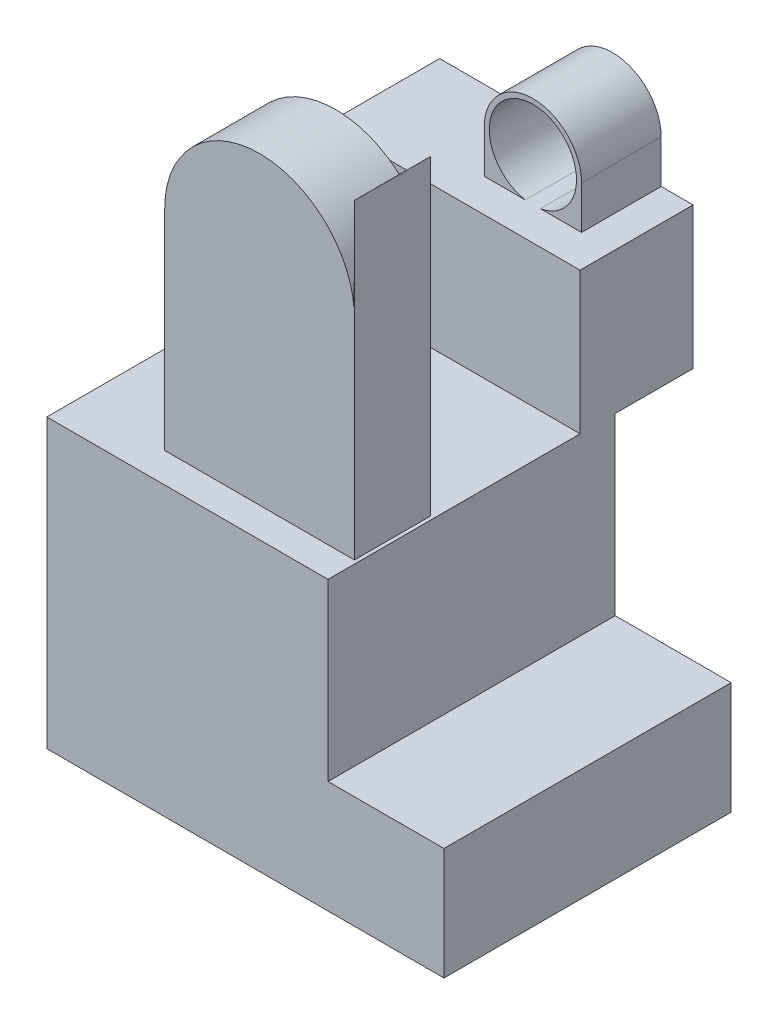
ISO-10303-21;
HEADER;
FILE_DESCRIPTION(('STEP AP214'),'2;1');
FILE_NAME('part.step','',(''),(''),'','','');
FILE_SCHEMA(('AUTOMOTIVE_DESIGN { 1 0 10303 214 1 1 1 1 }'));
ENDSEC;
DATA;
#1=APPLICATION_CONTEXT('core data for automotive mechanical design processes');
#2=APPLICATION_PROTOCOL_DEFINITION('international standard','automotive_design',2000,#1);
#3=PRODUCT_CONTEXT('',#1,'mechanical');
#4=PRODUCT('Part','Part','',(#3));
#5=PRODUCT_RELATED_PRODUCT_CATEGORY('part','',(#4));
#6=PRODUCT_DEFINITION_FORMATION('','',#4);
#7=PRODUCT_DEFINITION_CONTEXT('part definition',#1,'design');
#8=PRODUCT_DEFINITION('design','',#6,#7);
#9=PRODUCT_DEFINITION_SHAPE('','',#8);
#10=(LENGTH_UNIT() NAMED_UNIT(*) SI_UNIT(.MILLI.,.METRE.));
#11=(NAMED_UNIT(*) PLANE_ANGLE_UNIT() SI_UNIT($,.RADIAN.));
#12=(NAMED_UNIT(*) SI_UNIT($,.STERADIAN.) SOLID_ANGLE_UNIT());
#13=UNCERTAINTY_MEASURE_WITH_UNIT(LENGTH_MEASURE(1.E-05),#10,'distance_accuracy_value','');
#14=(GEOMETRIC_REPRESENTATION_CONTEXT(3) GLOBAL_UNCERTAINTY_ASSIGNED_CONTEXT((#13)) GLOBAL_UNIT_ASSIGNED_CONTEXT((#10,
#11,#12)) REPRESENTATION_CONTEXT('',''));
#15=CARTESIAN_POINT('',(0.,0.,0.));
#16=DIRECTION('',(0.,0.,1.));
#17=DIRECTION('',(1.,0.,0.));
#18=AXIS2_PLACEMENT_3D('',#15,#16,#17);
#19=CARTESIAN_POINT('',(-18.0355036301896,121.857061946903,45.63691496334));
#20=DIRECTION('',(1.,0.,0.));
#21=DIRECTION('',(0.,0.,-1.));
#22=AXIS2_PLACEMENT_3D('',#19,#20,#21);
#23=PLANE('',#22);
#24=DIRECTION('',(0.,0.,1.));
#25=VECTOR('',#24,1.);
#26=CARTESIAN_POINT('',(-18.0355036301896,96.2330757233509,42.7381903510704));
#27=LINE('',#26,#25);
#28=CARTESIAN_POINT('',(-18.0355036301896,96.2330757233509,45.63691496334));
#29=VERTEX_POINT('',#28);
#30=CARTESIAN_POINT('',(-18.0355036301896,96.2330757233509,64.8361903510704));
#31=VERTEX_POINT('',#30);
#32=EDGE_CURVE('E247',#29,#31,#27,.T.);
#33=ORIENTED_EDGE('',*,*,#32,.F.);
#34=DIRECTION('',(0.,-1.,0.));
#35=VECTOR('',#34,1.);
#36=CARTESIAN_POINT('',(-18.0355036301896,121.857061946903,45.63691496334));
#37=LINE('',#36,#35);
#38=CARTESIAN_POINT('',(-18.0355036301896,43.3710619469027,45.63691496334));
#39=VERTEX_POINT('',#38);
#40=EDGE_CURVE('E261',#29,#39,#37,.T.);
#41=ORIENTED_EDGE('',*,*,#40,.T.);
#42=DIRECTION('',(0.,0.,1.));
#43=VECTOR('',#42,1.);
#44=CARTESIAN_POINT('',(-18.0355036301896,43.3710619469027,45.63691496334));
#45=LINE('',#44,#43);
#46=CARTESIAN_POINT('',(-18.0355036301896,43.3710619469027,64.8361903510704));
#47=VERTEX_POINT('',#46);
#48=EDGE_CURVE('E252',#39,#47,#45,.T.);
#49=ORIENTED_EDGE('',*,*,#48,.T.);
#50=DIRECTION('',(0.,-1.,0.));
#51=VECTOR('',#50,1.);
#52=CARTESIAN_POINT('',(-18.0355036301896,121.857061946903,64.8361903510704));
#53=LINE('',#52,#51);
#54=EDGE_CURVE('E279',#31,#47,#53,.T.);
#55=ORIENTED_EDGE('',*,*,#54,.F.);
#56=EDGE_LOOP('',(#33,#41,#49,#55));
#57=FACE_BOUND('',#56,.T.);
#58=ADVANCED_FACE('F35',(#57),#23,.F.);
#59=CARTESIAN_POINT('',(-18.0355036301896,121.857061946903,64.8361903510704));
#60=DIRECTION('',(0.,0.,-1.));
#61=DIRECTION('',(-1.,0.,0.));
#62=AXIS2_PLACEMENT_3D('',#59,#60,#61);
#63=PLANE('',#62);
#64=CARTESIAN_POINT('',(5.87302798471995,96.2330757233509,64.8361903510704));
#65=DIRECTION('',(0.,0.,1.));
#66=DIRECTION('',(1.,0.,0.));
#67=AXIS2_PLACEMENT_3D('',#64,#65,#66);
#68=CIRCLE('',#67,23.9085316149096);
#69=CARTESIAN_POINT('',(29.7244375970077,97.8847849859018,64.8361903510704));
#70=VERTEX_POINT('',#69);
#71=EDGE_CURVE('E240',#70,#31,#68,.T.);
#72=ORIENTED_EDGE('',*,*,#71,.T.);
#73=ORIENTED_EDGE('',*,*,#54,.T.);
#74=DIRECTION('',(1.,0.,0.));
#75=VECTOR('',#74,1.);
#76=CARTESIAN_POINT('',(-18.0355036301896,43.3710619469027,64.8361903510704));
#77=LINE('',#76,#75);
#78=CARTESIAN_POINT('',(29.7815595996295,43.3710619469027,64.8361903510704));
#79=VERTEX_POINT('',#78);
#80=EDGE_CURVE('E264',#47,#79,#77,.T.);
#81=ORIENTED_EDGE('',*,*,#80,.T.);
#82=DIRECTION('',(0.,-1.,0.));
#83=VECTOR('',#82,1.);
#84=CARTESIAN_POINT('',(29.7815595996295,121.857061946903,64.8361903510704));
#85=LINE('',#84,#83);
#86=CARTESIAN_POINT('',(29.7815595996295,121.857061946903,64.8361903510704));
#87=VERTEX_POINT('',#86);
#88=EDGE_CURVE('E276',#87,#79,#85,.T.);
#89=ORIENTED_EDGE('',*,*,#88,.F.);
#90=DIRECTION('',(1.,0.,0.));
#91=VECTOR('',#90,1.);
#92=CARTESIAN_POINT('',(-18.0355036301896,121.857061946903,64.8361903510704));
#93=LINE('',#92,#91);
#94=CARTESIAN_POINT('',(29.7749437255236,121.857061946903,64.8361903510704));
#95=VERTEX_POINT('',#94);
#96=EDGE_CURVE('E253',#95,#87,#93,.T.);
#97=ORIENTED_EDGE('',*,*,#96,.F.);
#98=DIRECTION('',(-0.00210685103063139,-0.999997780586905,0.));
#99=VECTOR('',#98,1.);
#100=CARTESIAN_POINT('',(29.5180774531179,-0.0621903299303783,64.8361903510704));
#101=LINE('',#100,#99);
#102=EDGE_CURVE('E243',#95,#70,#101,.T.);
#103=ORIENTED_EDGE('',*,*,#102,.T.);
#104=EDGE_LOOP('',(#72,#73,#81,#89,#97,#103));
#105=FACE_BOUND('',#104,.T.);
#106=ADVANCED_FACE('F418',(#105),#63,.F.);
#107=CARTESIAN_POINT('',(-18.0355036301896,121.857061946903,45.63691496334));
#108=DIRECTION('',(0.,0.,1.));
#109=DIRECTION('',(1.,0.,0.));
#110=AXIS2_PLACEMENT_3D('',#107,#108,#109);
#111=PLANE('',#110);
#112=CARTESIAN_POINT('',(5.87302798471995,96.2330757233509,45.63691496334));
#113=DIRECTION('',(0.,0.,1.));
#114=DIRECTION('',(1.,0.,0.));
#115=AXIS2_PLACEMENT_3D('',#112,#113,#114);
#116=CIRCLE('',#115,23.9085316149096);
#117=CARTESIAN_POINT('',(29.7244375970077,97.8847849859018,45.63691496334));
#118=VERTEX_POINT('',#117);
#119=EDGE_CURVE('E350',#118,#29,#116,.T.);
#120=ORIENTED_EDGE('',*,*,#119,.F.);
#121=DIRECTION('',(-0.00210685103063139,-0.999997780586905,0.));
#122=VECTOR('',#121,1.);
#123=CARTESIAN_POINT('',(29.7747315034931,121.756332680177,45.63691496334));
#124=LINE('',#123,#122);
#125=CARTESIAN_POINT('',(29.7749437255236,121.857061946903,45.63691496334));
#126=VERTEX_POINT('',#125);
#127=EDGE_CURVE('E249',#126,#118,#124,.T.);
#128=ORIENTED_EDGE('',*,*,#127,.F.);
#129=DIRECTION('',(-1.,0.,0.));
#130=VECTOR('',#129,1.);
#131=CARTESIAN_POINT('',(-18.0355036301896,121.857061946903,45.63691496334));
#132=LINE('',#131,#130);
#133=CARTESIAN_POINT('',(29.7815595996295,121.857061946903,45.63691496334));
#134=VERTEX_POINT('',#133);
#135=EDGE_CURVE('E258',#134,#126,#132,.T.);
#136=ORIENTED_EDGE('',*,*,#135,.F.);
#137=DIRECTION('',(0.,-1.,0.));
#138=VECTOR('',#137,1.);
#139=CARTESIAN_POINT('',(29.7815595996295,121.857061946903,45.63691496334));
#140=LINE('',#139,#138);
#141=CARTESIAN_POINT('',(29.7815595996295,43.3710619469027,45.63691496334));
#142=VERTEX_POINT('',#141);
#143=EDGE_CURVE('E273',#134,#142,#140,.T.);
#144=ORIENTED_EDGE('',*,*,#143,.T.);
#145=DIRECTION('',(-1.,0.,0.));
#146=VECTOR('',#145,1.);
#147=CARTESIAN_POINT('',(-18.0355036301896,43.3710619469027,45.63691496334));
#148=LINE('',#147,#146);
#149=EDGE_CURVE('E256',#142,#39,#148,.T.);
#150=ORIENTED_EDGE('',*,*,#149,.T.);
#151=ORIENTED_EDGE('',*,*,#40,.F.);
#152=EDGE_LOOP('',(#120,#128,#136,#144,#150,#151));
#153=FACE_BOUND('',#152,.T.);
#154=ADVANCED_FACE('F425',(#153),#111,.F.);
#155=CARTESIAN_POINT('',(0.,121.857061946903,0.));
#156=DIRECTION('',(0.,1.,0.));
#157=DIRECTION('',(0.,0.,1.));
#158=AXIS2_PLACEMENT_3D('',#155,#156,#157);
#159=PLANE('',#158);
#160=ORIENTED_EDGE('',*,*,#135,.T.);
#161=DIRECTION('',(0.,0.,1.));
#162=VECTOR('',#161,1.);
#163=CARTESIAN_POINT('',(29.7749437255235,121.857061946903,0.));
#164=LINE('',#163,#162);
#165=EDGE_CURVE('E347',#126,#95,#164,.T.);
#166=ORIENTED_EDGE('',*,*,#165,.T.);
#167=ORIENTED_EDGE('',*,*,#96,.T.);
#168=DIRECTION('',(0.,0.,-1.));
#169=VECTOR('',#168,1.);
#170=CARTESIAN_POINT('',(29.7815595996295,121.857061946903,45.63691496334));
#171=LINE('',#170,#169);
#172=EDGE_CURVE('E255',#87,#134,#171,.T.);
#173=ORIENTED_EDGE('',*,*,#172,.T.);
#174=EDGE_LOOP('',(#160,#166,#167,#173));
#175=FACE_BOUND('',#174,.T.);
#176=ADVANCED_FACE('F446',(#175),#159,.T.);
#177=CARTESIAN_POINT('',(30.6814412238325,43.3710619469027,72.39));
#178=DIRECTION('',(0.,-1.,0.));
#179=DIRECTION('',(0.,0.,-1.));
#180=AXIS2_PLACEMENT_3D('',#177,#178,#179);
#181=PLANE('',#180);
#182=DIRECTION('',(1.,0.,0.));
#183=VECTOR('',#182,1.);
#184=CARTESIAN_POINT('',(30.6814412238325,43.3710619469027,8.85044599904986));
#185=LINE('',#184,#183);
#186=CARTESIAN_POINT('',(-33.2131284429536,43.3710619469027,8.85044599904985));
#187=VERTEX_POINT('',#186);
#188=CARTESIAN_POINT('',(30.6814412238325,43.3710619469027,8.85044599904985));
#189=VERTEX_POINT('',#188);
#190=EDGE_CURVE('E282',#187,#189,#185,.T.);
#191=ORIENTED_EDGE('',*,*,#190,.F.);
#192=DIRECTION('',(0.,0.,1.));
#193=VECTOR('',#192,1.);
#194=CARTESIAN_POINT('',(-33.2131284429536,43.3710619469027,8.85044599904985));
#195=LINE('',#194,#193);
#196=CARTESIAN_POINT('',(-33.2131284429536,43.3710619469027,0.));
#197=VERTEX_POINT('',#196);
#198=EDGE_CURVE('E290',#197,#187,#195,.T.);
#199=ORIENTED_EDGE('',*,*,#198,.F.);
#200=DIRECTION('',(-1.,0.,0.));
#201=VECTOR('',#200,1.);
#202=CARTESIAN_POINT('',(30.6814412238325,43.3710619469027,0.));
#203=LINE('',#202,#201);
#204=CARTESIAN_POINT('',(-40.2025410770525,43.3710619469027,0.));
#205=VERTEX_POINT('',#204);
#206=EDGE_CURVE('E328',#197,#205,#203,.T.);
#207=ORIENTED_EDGE('',*,*,#206,.T.);
#208=DIRECTION('',(0.,0.,-1.));
#209=VECTOR('',#208,1.);
#210=CARTESIAN_POINT('',(-40.2025410770525,43.3710619469027,72.39));
#211=LINE('',#210,#209);
#212=CARTESIAN_POINT('',(-40.2025410770525,43.3710619469027,72.39));
#213=VERTEX_POINT('',#212);
#214=EDGE_CURVE('E318',#213,#205,#211,.T.);
#215=ORIENTED_EDGE('',*,*,#214,.F.);
#216=DIRECTION('',(-1.,0.,0.));
#217=VECTOR('',#216,1.);
#218=CARTESIAN_POINT('',(30.6814412238325,43.3710619469027,72.39));
#219=LINE('',#218,#217);
#220=CARTESIAN_POINT('',(30.6814412238325,43.3710619469027,72.39));
#221=VERTEX_POINT('',#220);
#222=EDGE_CURVE('E316',#221,#213,#219,.T.);
#223=ORIENTED_EDGE('',*,*,#222,.F.);
#224=DIRECTION('',(0.,0.,-1.));
#225=VECTOR('',#224,1.);
#226=CARTESIAN_POINT('',(30.6814412238325,43.3710619469027,72.39));
#227=LINE('',#226,#225);
#228=EDGE_CURVE('E333',#221,#189,#227,.T.);
#229=ORIENTED_EDGE('',*,*,#228,.T.);
#230=EDGE_LOOP('',(#191,#199,#207,#215,#223,#229));
#231=FACE_BOUND('',#230,.T.);
#232=ORIENTED_EDGE('',*,*,#48,.F.);
#233=ORIENTED_EDGE('',*,*,#149,.F.);
#234=DIRECTION('',(0.,0.,-1.));
#235=VECTOR('',#234,1.);
#236=CARTESIAN_POINT('',(29.7815595996295,43.3710619469027,45.63691496334));
#237=LINE('',#236,#235);
#238=EDGE_CURVE('E267',#79,#142,#237,.T.);
#239=ORIENTED_EDGE('',*,*,#238,.F.);
#240=ORIENTED_EDGE('',*,*,#80,.F.);
#241=EDGE_LOOP('',(#232,#233,#239,#240));
#242=FACE_BOUND('',#241,.T.);
#243=ADVANCED_FACE('F375',(#231,#242),#181,.F.);
#244=CARTESIAN_POINT('',(-40.2025410770525,-0.764247787610634,72.39));
#245=DIRECTION('',(1.,0.,0.));
#246=DIRECTION('',(0.,0.,-1.));
#247=AXIS2_PLACEMENT_3D('',#244,#245,#246);
#248=PLANE('',#247);
#249=DIRECTION('',(0.,-1.,0.));
#250=VECTOR('',#249,1.);
#251=CARTESIAN_POINT('',(-40.2025410770525,-0.764247787610634,0.));
#252=LINE('',#251,#250);
#253=CARTESIAN_POINT('',(-40.2025410770525,-29.0414159292035,0.));
#254=VERTEX_POINT('',#253);
#255=EDGE_CURVE('E295',#205,#254,#252,.T.);
#256=ORIENTED_EDGE('',*,*,#255,.T.);
#257=DIRECTION('',(0.,0.,-1.));
#258=VECTOR('',#257,1.);
#259=CARTESIAN_POINT('',(-40.2025410770525,-29.0414159292035,72.39));
#260=LINE('',#259,#258);
#261=CARTESIAN_POINT('',(-40.2025410770525,-29.0414159292035,72.39));
#262=VERTEX_POINT('',#261);
#263=EDGE_CURVE('E344',#262,#254,#260,.T.);
#264=ORIENTED_EDGE('',*,*,#263,.F.);
#265=DIRECTION('',(0.,-1.,0.));
#266=VECTOR('',#265,1.);
#267=CARTESIAN_POINT('',(-40.2025410770525,-0.764247787610634,72.39));
#268=LINE('',#267,#266);
#269=EDGE_CURVE('E305',#213,#262,#268,.T.);
#270=ORIENTED_EDGE('',*,*,#269,.F.);
#271=ORIENTED_EDGE('',*,*,#214,.T.);
#272=EDGE_LOOP('',(#256,#264,#270,#271));
#273=FACE_BOUND('',#272,.T.);
#274=ADVANCED_FACE('F37',(#273),#248,.F.);
#275=CARTESIAN_POINT('',(-40.2025410770525,-29.0414159292035,72.39));
#276=DIRECTION('',(0.,1.,0.));
#277=DIRECTION('',(0.,0.,1.));
#278=AXIS2_PLACEMENT_3D('',#275,#276,#277);
#279=PLANE('',#278);
#280=DIRECTION('',(1.,0.,0.));
#281=VECTOR('',#280,1.);
#282=CARTESIAN_POINT('',(-40.2025410770525,-29.0414159292035,0.));
#283=LINE('',#282,#281);
#284=CARTESIAN_POINT('',(59.9139190999387,-29.0414159292035,0.));
#285=VERTEX_POINT('',#284);
#286=EDGE_CURVE('E320',#254,#285,#283,.T.);
#287=ORIENTED_EDGE('',*,*,#286,.T.);
#288=DIRECTION('',(0.,0.,-1.));
#289=VECTOR('',#288,1.);
#290=CARTESIAN_POINT('',(59.9139190999387,-29.0414159292035,72.39));
#291=LINE('',#290,#289);
#292=CARTESIAN_POINT('',(59.9139190999387,-29.0414159292035,72.39));
#293=VERTEX_POINT('',#292);
#294=EDGE_CURVE('E341',#293,#285,#291,.T.);
#295=ORIENTED_EDGE('',*,*,#294,.F.);
#296=DIRECTION('',(1.,0.,0.));
#297=VECTOR('',#296,1.);
#298=CARTESIAN_POINT('',(-40.2025410770525,-29.0414159292035,72.39));
#299=LINE('',#298,#297);
#300=EDGE_CURVE('E307',#262,#293,#299,.T.);
#301=ORIENTED_EDGE('',*,*,#300,.F.);
#302=ORIENTED_EDGE('',*,*,#263,.T.);
#303=EDGE_LOOP('',(#287,#295,#301,#302));
#304=FACE_BOUND('',#303,.T.);
#305=ADVANCED_FACE('F407',(#304),#279,.F.);
#306=CARTESIAN_POINT('',(59.9139190999387,-0.764247787610634,72.39));
#307=DIRECTION('',(-1.,0.,0.));
#308=DIRECTION('',(0.,0.,1.));
#309=AXIS2_PLACEMENT_3D('',#306,#307,#308);
#310=PLANE('',#309);
#311=DIRECTION('',(0.,1.,0.));
#312=VECTOR('',#311,1.);
#313=CARTESIAN_POINT('',(59.9139190999387,-0.764247787610634,0.));
#314=LINE('',#313,#312);
#315=CARTESIAN_POINT('',(59.9139190999387,-0.764247787610634,0.));
#316=VERTEX_POINT('',#315);
#317=EDGE_CURVE('E322',#285,#316,#314,.T.);
#318=ORIENTED_EDGE('',*,*,#317,.T.);
#319=DIRECTION('',(0.,0.,-1.));
#320=VECTOR('',#319,1.);
#321=CARTESIAN_POINT('',(59.9139190999387,-0.764247787610634,72.39));
#322=LINE('',#321,#320);
#323=CARTESIAN_POINT('',(59.9139190999387,-0.764247787610634,72.39));
#324=VERTEX_POINT('',#323);
#325=EDGE_CURVE('E338',#324,#316,#322,.T.);
#326=ORIENTED_EDGE('',*,*,#325,.F.);
#327=DIRECTION('',(0.,1.,0.));
#328=VECTOR('',#327,1.);
#329=CARTESIAN_POINT('',(59.9139190999387,-0.764247787610634,72.39));
#330=LINE('',#329,#328);
#331=EDGE_CURVE('E310',#293,#324,#330,.T.);
#332=ORIENTED_EDGE('',*,*,#331,.F.);
#333=ORIENTED_EDGE('',*,*,#294,.T.);
#334=EDGE_LOOP('',(#318,#326,#332,#333));
#335=FACE_BOUND('',#334,.T.);
#336=ADVANCED_FACE('F409',(#335),#310,.F.);
#337=CARTESIAN_POINT('',(30.6814412238325,-0.764247787610625,72.39));
#338=DIRECTION('',(0.,-1.,0.));
#339=DIRECTION('',(1.,0.,0.));
#340=AXIS2_PLACEMENT_3D('',#337,#338,#339);
#341=PLANE('',#340);
#342=DIRECTION('',(-1.,0.,0.));
#343=VECTOR('',#342,1.);
#344=CARTESIAN_POINT('',(30.6814412238325,-0.764247787610625,0.));
#345=LINE('',#344,#343);
#346=CARTESIAN_POINT('',(30.6814412238325,-0.764247787610625,0.));
#347=VERTEX_POINT('',#346);
#348=EDGE_CURVE('E324',#316,#347,#345,.T.);
#349=ORIENTED_EDGE('',*,*,#348,.T.);
#350=DIRECTION('',(0.,0.,-1.));
#351=VECTOR('',#350,1.);
#352=CARTESIAN_POINT('',(30.6814412238325,-0.764247787610625,72.39));
#353=LINE('',#352,#351);
#354=CARTESIAN_POINT('',(30.6814412238325,-0.764247787610625,72.39));
#355=VERTEX_POINT('',#354);
#356=EDGE_CURVE('E335',#355,#347,#353,.T.);
#357=ORIENTED_EDGE('',*,*,#356,.F.);
#358=DIRECTION('',(-1.,0.,0.));
#359=VECTOR('',#358,1.);
#360=CARTESIAN_POINT('',(30.6814412238325,-0.764247787610625,72.39));
#361=LINE('',#360,#359);
#362=EDGE_CURVE('E312',#324,#355,#361,.T.);
#363=ORIENTED_EDGE('',*,*,#362,.F.);
#364=ORIENTED_EDGE('',*,*,#325,.T.);
#365=EDGE_LOOP('',(#349,#357,#363,#364));
#366=FACE_BOUND('',#365,.T.);
#367=ADVANCED_FACE('F386',(#366),#341,.F.);
#368=CARTESIAN_POINT('',(30.6814412238325,-0.764247787610625,72.39));
#369=DIRECTION('',(-1.,0.,0.));
#370=DIRECTION('',(0.,0.,1.));
#371=AXIS2_PLACEMENT_3D('',#368,#369,#370);
#372=PLANE('',#371);
#373=DIRECTION('',(0.,0.,-1.));
#374=VECTOR('',#373,1.);
#375=CARTESIAN_POINT('',(30.6814412238325,43.3710619469027,8.85044599904986));
#376=LINE('',#375,#374);
#377=CARTESIAN_POINT('',(30.6814412238325,43.3710619469027,0.));
#378=VERTEX_POINT('',#377);
#379=CARTESIAN_POINT('',(30.6814412238325,43.3710619469027,-19.6362975827268));
#380=VERTEX_POINT('',#379);
#381=EDGE_CURVE('E289',#378,#380,#376,.T.);
#382=ORIENTED_EDGE('',*,*,#381,.T.);
#383=DIRECTION('',(0.,1.,0.));
#384=VECTOR('',#383,1.);
#385=CARTESIAN_POINT('',(30.6814412238325,-0.764247787610625,-19.6362975827268));
#386=LINE('',#385,#384);
#387=CARTESIAN_POINT('',(30.6814412238325,79.0945512167811,-19.6362975827268));
#388=VERTEX_POINT('',#387);
#389=EDGE_CURVE('E237',#380,#388,#386,.T.);
#390=ORIENTED_EDGE('',*,*,#389,.T.);
#391=DIRECTION('',(0.,0.,-1.));
#392=VECTOR('',#391,1.);
#393=CARTESIAN_POINT('',(30.6814412238325,79.0945512167811,8.85044599904985));
#394=LINE('',#393,#392);
#395=CARTESIAN_POINT('',(30.6814412238325,79.0945512167811,8.85044599904986));
#396=VERTEX_POINT('',#395);
#397=EDGE_CURVE('E296',#396,#388,#394,.T.);
#398=ORIENTED_EDGE('',*,*,#397,.F.);
#399=DIRECTION('',(0.,-1.,0.));
#400=VECTOR('',#399,1.);
#401=CARTESIAN_POINT('',(30.6814412238325,160.588921059966,8.85044599904986));
#402=LINE('',#401,#400);
#403=EDGE_CURVE('E281',#396,#189,#402,.T.);
#404=ORIENTED_EDGE('',*,*,#403,.T.);
#405=ORIENTED_EDGE('',*,*,#228,.F.);
#406=DIRECTION('',(0.,1.,0.));
#407=VECTOR('',#406,1.);
#408=CARTESIAN_POINT('',(30.6814412238325,-0.764247787610625,72.39));
#409=LINE('',#408,#407);
#410=EDGE_CURVE('E314',#355,#221,#409,.T.);
#411=ORIENTED_EDGE('',*,*,#410,.F.);
#412=ORIENTED_EDGE('',*,*,#356,.T.);
#413=DIRECTION('',(0.,1.,0.));
#414=VECTOR('',#413,1.);
#415=CARTESIAN_POINT('',(30.6814412238325,-0.764247787610625,0.));
#416=LINE('',#415,#414);
#417=EDGE_CURVE('E326',#347,#378,#416,.T.);
#418=ORIENTED_EDGE('',*,*,#417,.T.);
#419=EDGE_LOOP('',(#382,#390,#398,#404,#405,#411,#412,#418));
#420=FACE_BOUND('',#419,.T.);
#421=ADVANCED_FACE('F362',(#420),#372,.F.);
#422=CARTESIAN_POINT('',(0.,0.,72.39));
#423=DIRECTION('',(0.,0.,1.));
#424=DIRECTION('',(1.,0.,0.));
#425=AXIS2_PLACEMENT_3D('',#422,#423,#424);
#426=PLANE('',#425);
#427=ORIENTED_EDGE('',*,*,#269,.T.);
#428=ORIENTED_EDGE('',*,*,#300,.T.);
#429=ORIENTED_EDGE('',*,*,#331,.T.);
#430=ORIENTED_EDGE('',*,*,#362,.T.);
#431=ORIENTED_EDGE('',*,*,#410,.T.);
#432=ORIENTED_EDGE('',*,*,#222,.T.);
#433=EDGE_LOOP('',(#427,#428,#429,#430,#431,#432));
#434=FACE_BOUND('',#433,.T.);
#435=ADVANCED_FACE('F379',(#434),#426,.T.);
#436=CARTESIAN_POINT('',(0.,0.,0.));
#437=DIRECTION('',(0.,0.,1.));
#438=DIRECTION('',(1.,0.,0.));
#439=AXIS2_PLACEMENT_3D('',#436,#437,#438);
#440=PLANE('',#439);
#441=ORIENTED_EDGE('',*,*,#255,.F.);
#442=ORIENTED_EDGE('',*,*,#206,.F.);
#443=EDGE_CURVE('E308',#378,#197,#203,.T.);
#444=ORIENTED_EDGE('',*,*,#443,.F.);
#445=ORIENTED_EDGE('',*,*,#417,.F.);
#446=ORIENTED_EDGE('',*,*,#348,.F.);
#447=ORIENTED_EDGE('',*,*,#317,.F.);
#448=ORIENTED_EDGE('',*,*,#286,.F.);
#449=EDGE_LOOP('',(#441,#442,#444,#445,#446,#447,#448));
#450=FACE_BOUND('',#449,.T.);
#451=ADVANCED_FACE('F392',(#450),#440,.F.);
#452=CARTESIAN_POINT('',(0.,43.3710619469027,0.));
#453=DIRECTION('',(0.,1.,0.));
#454=DIRECTION('',(0.,0.,1.));
#455=AXIS2_PLACEMENT_3D('',#452,#453,#454);
#456=PLANE('',#455);
#457=CARTESIAN_POINT('',(-33.2131284429536,43.3710619469027,-19.6362975827268));
#458=VERTEX_POINT('',#457);
#459=EDGE_CURVE('E287',#458,#197,#195,.T.);
#460=ORIENTED_EDGE('',*,*,#459,.F.);
#461=DIRECTION('',(1.,0.,0.));
#462=VECTOR('',#461,1.);
#463=CARTESIAN_POINT('',(0.,43.3710619469027,-19.6362975827268));
#464=LINE('',#463,#462);
#465=EDGE_CURVE('E234',#458,#380,#464,.T.);
#466=ORIENTED_EDGE('',*,*,#465,.T.);
#467=ORIENTED_EDGE('',*,*,#381,.F.);
#468=ORIENTED_EDGE('',*,*,#443,.T.);
#469=EDGE_LOOP('',(#460,#466,#467,#468));
#470=FACE_BOUND('',#469,.T.);
#471=ADVANCED_FACE('F397',(#470),#456,.F.);
#472=CARTESIAN_POINT('',(-33.2131284429536,160.588921059966,8.85044599904985));
#473=DIRECTION('',(1.,0.,0.));
#474=DIRECTION('',(0.,0.,-1.));
#475=AXIS2_PLACEMENT_3D('',#472,#473,#474);
#476=PLANE('',#475);
#477=DIRECTION('',(0.,0.,1.));
#478=VECTOR('',#477,1.);
#479=CARTESIAN_POINT('',(-33.2131284429536,79.0945512167811,8.85044599904984));
#480=LINE('',#479,#478);
#481=CARTESIAN_POINT('',(-33.2131284429536,79.0945512167811,-19.6362975827268));
#482=VERTEX_POINT('',#481);
#483=CARTESIAN_POINT('',(-33.2131284429536,79.0945512167811,8.85044599904985));
#484=VERTEX_POINT('',#483);
#485=EDGE_CURVE('E293',#482,#484,#480,.T.);
#486=ORIENTED_EDGE('',*,*,#485,.F.);
#487=DIRECTION('',(0.,-1.,0.));
#488=VECTOR('',#487,1.);
#489=CARTESIAN_POINT('',(-33.2131284429536,160.588921059966,-19.6362975827268));
#490=LINE('',#489,#488);
#491=EDGE_CURVE('E231',#482,#458,#490,.T.);
#492=ORIENTED_EDGE('',*,*,#491,.T.);
#493=ORIENTED_EDGE('',*,*,#459,.T.);
#494=ORIENTED_EDGE('',*,*,#198,.T.);
#495=DIRECTION('',(0.,-1.,0.));
#496=VECTOR('',#495,1.);
#497=CARTESIAN_POINT('',(-33.2131284429536,160.588921059966,8.85044599904985));
#498=LINE('',#497,#496);
#499=EDGE_CURVE('E286',#484,#187,#498,.T.);
#500=ORIENTED_EDGE('',*,*,#499,.F.);
#501=EDGE_LOOP('',(#486,#492,#493,#494,#500));
#502=FACE_BOUND('',#501,.T.);
#503=ADVANCED_FACE('F399',(#502),#476,.F.);
#504=CARTESIAN_POINT('',(30.6814412238325,160.588921059966,8.85044599904986));
#505=DIRECTION('',(0.,0.,-1.));
#506=DIRECTION('',(-1.,0.,0.));
#507=AXIS2_PLACEMENT_3D('',#504,#505,#506);
#508=PLANE('',#507);
#509=DIRECTION('',(1.,0.,0.));
#510=VECTOR('',#509,1.);
#511=CARTESIAN_POINT('',(30.6814412238325,79.0945512167811,8.85044599904986));
#512=LINE('',#511,#510);
#513=EDGE_CURVE('E285',#484,#396,#512,.T.);
#514=ORIENTED_EDGE('',*,*,#513,.F.);
#515=ORIENTED_EDGE('',*,*,#499,.T.);
#516=ORIENTED_EDGE('',*,*,#190,.T.);
#517=ORIENTED_EDGE('',*,*,#403,.F.);
#518=EDGE_LOOP('',(#514,#515,#516,#517));
#519=FACE_BOUND('',#518,.T.);
#520=ADVANCED_FACE('F369',(#519),#508,.F.);
#521=CARTESIAN_POINT('',(10.3636274766045,79.0945512167811,-219.026297582727));
#522=DIRECTION('',(0.,1.,0.));
#523=DIRECTION('',(0.,0.,-1.));
#524=AXIS2_PLACEMENT_3D('',#521,#522,#523);
#525=PLANE('',#524);
#526=DIRECTION('',(0.,0.,-1.));
#527=VECTOR('',#526,1.);
#528=CARTESIAN_POINT('',(22.6336274766045,79.0945512167811,-219.026297582727));
#529=LINE('',#528,#527);
#530=CARTESIAN_POINT('',(22.6336274766046,79.0945512167811,0.429702417273265));
#531=VERTEX_POINT('',#530);
#532=CARTESIAN_POINT('',(22.6336274766046,79.0945512167811,-19.6362975827268));
#533=VERTEX_POINT('',#532);
#534=EDGE_CURVE('E229',#531,#533,#529,.T.);
#535=ORIENTED_EDGE('',*,*,#534,.F.);
#536=DIRECTION('',(-1.,0.,0.));
#537=VECTOR('',#536,1.);
#538=CARTESIAN_POINT('',(10.3636274766046,79.0945512167811,0.429702417273276));
#539=LINE('',#538,#537);
#540=CARTESIAN_POINT('',(12.2649178101085,79.0945512167811,0.429702417273268));
#541=VERTEX_POINT('',#540);
#542=EDGE_CURVE('E11',#531,#541,#539,.T.);
#543=ORIENTED_EDGE('',*,*,#542,.T.);
#544=DIRECTION('',(0.,0.,-1.));
#545=VECTOR('',#544,1.);
#546=CARTESIAN_POINT('',(12.2649178101085,79.0945512167811,0.429702417273266));
#547=LINE('',#546,#545);
#548=CARTESIAN_POINT('',(12.2649178101085,79.0945512167811,-19.6362975827268));
#549=VERTEX_POINT('',#548);
#550=EDGE_CURVE('E225',#541,#549,#547,.T.);
#551=ORIENTED_EDGE('',*,*,#550,.T.);
#552=DIRECTION('',(1.,0.,0.));
#553=VECTOR('',#552,1.);
#554=CARTESIAN_POINT('',(10.3636274766046,79.0945512167811,-19.6362975827268));
#555=LINE('',#554,#553);
#556=CARTESIAN_POINT('',(8.46233714310066,79.0945512167811,-19.6362975827268));
#557=VERTEX_POINT('',#556);
#558=EDGE_CURVE('E354',#557,#549,#555,.T.);
#559=ORIENTED_EDGE('',*,*,#558,.F.);
#560=DIRECTION('',(0.,0.,-1.));
#561=VECTOR('',#560,1.);
#562=CARTESIAN_POINT('',(8.46233714310066,79.0945512167811,0.429702417273267));
#563=LINE('',#562,#561);
#564=CARTESIAN_POINT('',(8.46233714310066,79.0945512167811,0.429702417273269));
#565=VERTEX_POINT('',#564);
#566=EDGE_CURVE('E221',#557,#565,#563,.F.);
#567=ORIENTED_EDGE('',*,*,#566,.T.);
#568=CARTESIAN_POINT('',(-1.89970425414928,79.0945512167811,0.429702417273275));
#569=VERTEX_POINT('',#568);
#570=EDGE_CURVE('E39',#565,#569,#539,.T.);
#571=ORIENTED_EDGE('',*,*,#570,.T.);
#572=DIRECTION('',(0.,0.,1.));
#573=VECTOR('',#572,1.);
#574=CARTESIAN_POINT('',(-1.89970425414934,79.0945512167811,-219.026297582727));
#575=LINE('',#574,#573);
#576=CARTESIAN_POINT('',(-1.89970425414929,79.0945512167811,-19.6362975827268));
#577=VERTEX_POINT('',#576);
#578=EDGE_CURVE('E194',#577,#569,#575,.T.);
#579=ORIENTED_EDGE('',*,*,#578,.F.);
#580=EDGE_CURVE('E352',#482,#577,#555,.T.);
#581=ORIENTED_EDGE('',*,*,#580,.F.);
#582=ORIENTED_EDGE('',*,*,#485,.T.);
#583=ORIENTED_EDGE('',*,*,#513,.T.);
#584=ORIENTED_EDGE('',*,*,#397,.T.);
#585=EDGE_CURVE('E351',#533,#388,#555,.T.);
#586=ORIENTED_EDGE('',*,*,#585,.F.);
#587=EDGE_LOOP('',(#535,#543,#551,#559,#567,#571,#579,#581,#582,#583,#584,#586));
#588=FACE_BOUND('',#587,.T.);
#589=ADVANCED_FACE('F364',(#588),#525,.T.);
#590=CARTESIAN_POINT('',(29.7815595996295,121.857061946903,45.63691496334));
#591=DIRECTION('',(-1.,0.,0.));
#592=DIRECTION('',(0.,0.,1.));
#593=AXIS2_PLACEMENT_3D('',#590,#591,#592);
#594=PLANE('',#593);
#595=ORIENTED_EDGE('',*,*,#238,.T.);
#596=ORIENTED_EDGE('',*,*,#143,.F.);
#597=ORIENTED_EDGE('',*,*,#172,.F.);
#598=ORIENTED_EDGE('',*,*,#88,.T.);
#599=EDGE_LOOP('',(#595,#596,#597,#598));
#600=FACE_BOUND('',#599,.T.);
#601=ADVANCED_FACE('F439',(#600),#594,.F.);
#602=CARTESIAN_POINT('',(5.87302798471995,96.2330757233509,42.7381903510704));
#603=DIRECTION('',(0.,0.,1.));
#604=DIRECTION('',(1.,0.,0.));
#605=AXIS2_PLACEMENT_3D('',#602,#603,#604);
#606=CYLINDRICAL_SURFACE('',#605,23.9085316149096);
#607=ORIENTED_EDGE('',*,*,#119,.T.);
#608=ORIENTED_EDGE('',*,*,#32,.T.);
#609=ORIENTED_EDGE('',*,*,#71,.F.);
#610=DIRECTION('',(0.,0.,1.));
#611=VECTOR('',#610,1.);
#612=CARTESIAN_POINT('',(29.7244375970077,97.8847849859018,42.7381903510704));
#613=LINE('',#612,#611);
#614=EDGE_CURVE('E246',#118,#70,#613,.T.);
#615=ORIENTED_EDGE('',*,*,#614,.F.);
#616=EDGE_LOOP('',(#607,#608,#609,#615));
#617=FACE_BOUND('',#616,.T.);
#618=ADVANCED_FACE('F478',(#617),#606,.T.);
#619=CARTESIAN_POINT('',(29.5180774531179,-0.0621903299303783,42.7381903510704));
#620=DIRECTION('',(-0.999997780586905,0.00210685103063139,0.));
#621=DIRECTION('',(-0.00210685103063139,-0.999997780586905,0.));
#622=AXIS2_PLACEMENT_3D('',#619,#620,#621);
#623=PLANE('',#622);
#624=ORIENTED_EDGE('',*,*,#127,.T.);
#625=ORIENTED_EDGE('',*,*,#614,.T.);
#626=ORIENTED_EDGE('',*,*,#102,.F.);
#627=ORIENTED_EDGE('',*,*,#165,.F.);
#628=EDGE_LOOP('',(#624,#625,#626,#627));
#629=FACE_BOUND('',#628,.T.);
#630=ADVANCED_FACE('F485',(#629),#623,.T.);
#631=CARTESIAN_POINT('',(0.,0.,-19.6362975827268));
#632=DIRECTION('',(0.,0.,1.));
#633=DIRECTION('',(1.,0.,0.));
#634=AXIS2_PLACEMENT_3D('',#631,#632,#633);
#635=PLANE('',#634);
#636=DIRECTION('',(0.,-1.,0.));
#637=VECTOR('',#636,1.);
#638=CARTESIAN_POINT('',(22.6336274766046,0.,-19.6362975827268));
#639=LINE('',#638,#637);
#640=CARTESIAN_POINT('',(22.6336274766046,89.9289914454097,-19.6362975827268));
#641=VERTEX_POINT('',#640);
#642=EDGE_CURVE('E50',#641,#533,#639,.T.);
#643=ORIENTED_EDGE('',*,*,#642,.T.);
#644=ORIENTED_EDGE('',*,*,#585,.T.);
#645=ORIENTED_EDGE('',*,*,#389,.F.);
#646=ORIENTED_EDGE('',*,*,#465,.F.);
#647=ORIENTED_EDGE('',*,*,#491,.F.);
#648=ORIENTED_EDGE('',*,*,#580,.T.);
#649=DIRECTION('',(0.00180097318278887,0.999998378246483,0.));
#650=VECTOR('',#649,1.);
#651=CARTESIAN_POINT('',(-2.04214502708212,0.00367785439371385,-19.6362975827268));
#652=LINE('',#651,#650);
#653=CARTESIAN_POINT('',(-1.87870863230358,90.7524637257711,-19.6362975827268));
#654=VERTEX_POINT('',#653);
#655=EDGE_CURVE('E217',#577,#654,#652,.T.);
#656=ORIENTED_EDGE('',*,*,#655,.T.);
#657=CARTESIAN_POINT('',(10.3636274766046,89.9289914454097,-19.6362975827268));
#658=DIRECTION('',(0.,0.,-1.));
#659=DIRECTION('',(-1.,0.,0.));
#660=AXIS2_PLACEMENT_3D('',#657,#658,#659);
#661=CIRCLE('',#660,12.27);
#662=EDGE_CURVE('E204',#654,#641,#661,.T.);
#663=ORIENTED_EDGE('',*,*,#662,.T.);
#664=EDGE_LOOP('',(#643,#644,#645,#646,#647,#648,#656,#663));
#665=FACE_BOUND('',#664,.T.);
#666=ORIENTED_EDGE('',*,*,#558,.T.);
#667=CARTESIAN_POINT('',(10.3636274766046,89.9289914454097,-19.6362975827268));
#668=DIRECTION('',(0.,0.,-1.));
#669=DIRECTION('',(-1.,0.,0.));
#670=AXIS2_PLACEMENT_3D('',#667,#668,#669);
#671=CIRCLE('',#670,11.);
#672=EDGE_CURVE('E57',#557,#549,#671,.T.);
#673=ORIENTED_EDGE('',*,*,#672,.F.);
#674=EDGE_LOOP('',(#666,#673));
#675=FACE_BOUND('',#674,.T.);
#676=ADVANCED_FACE('F357',(#665,#675),#635,.F.);
#677=CARTESIAN_POINT('',(22.6336274766046,0.,0.429702417273265));
#678=DIRECTION('',(1.,0.,0.));
#679=DIRECTION('',(0.,1.,0.));
#680=AXIS2_PLACEMENT_3D('',#677,#678,#679);
#681=PLANE('',#680);
#682=DIRECTION('',(0.,-1.,0.));
#683=VECTOR('',#682,1.);
#684=CARTESIAN_POINT('',(22.6336274766046,0.,0.429702417273265));
#685=LINE('',#684,#683);
#686=CARTESIAN_POINT('',(22.6336274766046,89.9289914454097,0.429702417273265));
#687=VERTEX_POINT('',#686);
#688=EDGE_CURVE('E199',#687,#531,#685,.T.);
#689=ORIENTED_EDGE('',*,*,#688,.T.);
#690=ORIENTED_EDGE('',*,*,#534,.T.);
#691=ORIENTED_EDGE('',*,*,#642,.F.);
#692=DIRECTION('',(0.,0.,-1.));
#693=VECTOR('',#692,1.);
#694=CARTESIAN_POINT('',(22.6336274766046,89.9289914454097,0.429702417273265));
#695=LINE('',#694,#693);
#696=EDGE_CURVE('E205',#687,#641,#695,.T.);
#697=ORIENTED_EDGE('',*,*,#696,.F.);
#698=EDGE_LOOP('',(#689,#690,#691,#697));
#699=FACE_BOUND('',#698,.T.);
#700=ADVANCED_FACE('F498',(#699),#681,.T.);
#701=CARTESIAN_POINT('',(10.3636274766046,89.9289914454097,0.429702417273269));
#702=DIRECTION('',(0.,0.,-1.));
#703=DIRECTION('',(-1.,0.,0.));
#704=AXIS2_PLACEMENT_3D('',#701,#702,#703);
#705=CYLINDRICAL_SURFACE('',#704,12.27);
#706=ORIENTED_EDGE('',*,*,#662,.F.);
#707=DIRECTION('',(0.,0.,-1.));
#708=VECTOR('',#707,1.);
#709=CARTESIAN_POINT('',(-1.87870863230357,90.7524637257711,0.429702417273272));
#710=LINE('',#709,#708);
#711=CARTESIAN_POINT('',(-1.87870863230357,90.7524637257711,0.429702417273272));
#712=VERTEX_POINT('',#711);
#713=EDGE_CURVE('E191',#712,#654,#710,.T.);
#714=ORIENTED_EDGE('',*,*,#713,.F.);
#715=CARTESIAN_POINT('',(10.3636274766046,89.9289914454097,0.429702417273269));
#716=DIRECTION('',(0.,0.,-1.));
#717=DIRECTION('',(-1.,0.,0.));
#718=AXIS2_PLACEMENT_3D('',#715,#716,#717);
#719=CIRCLE('',#718,12.27);
#720=EDGE_CURVE('E198',#712,#687,#719,.T.);
#721=ORIENTED_EDGE('',*,*,#720,.T.);
#722=ORIENTED_EDGE('',*,*,#696,.T.);
#723=EDGE_LOOP('',(#706,#714,#721,#722));
#724=FACE_BOUND('',#723,.T.);
#725=ADVANCED_FACE('F203',(#724),#705,.T.);
#726=CARTESIAN_POINT('',(-2.04214502708212,0.00367785439371385,0.429702417273272));
#727=DIRECTION('',(-0.999998378246483,0.00180097318278887,0.));
#728=DIRECTION('',(-0.00180097318278887,-0.999998378246483,0.));
#729=AXIS2_PLACEMENT_3D('',#726,#727,#728);
#730=PLANE('',#729);
#731=ORIENTED_EDGE('',*,*,#655,.F.);
#732=ORIENTED_EDGE('',*,*,#578,.T.);
#733=DIRECTION('',(0.00180097318278887,0.999998378246483,0.));
#734=VECTOR('',#733,1.);
#735=CARTESIAN_POINT('',(-2.04214502708212,0.00367785439371385,0.429702417273272));
#736=LINE('',#735,#734);
#737=EDGE_CURVE('E188',#569,#712,#736,.T.);
#738=ORIENTED_EDGE('',*,*,#737,.T.);
#739=ORIENTED_EDGE('',*,*,#713,.T.);
#740=EDGE_LOOP('',(#731,#732,#738,#739));
#741=FACE_BOUND('',#740,.T.);
#742=ADVANCED_FACE('F190',(#741),#730,.T.);
#743=CARTESIAN_POINT('',(10.3636274766046,89.9289914454097,0.429702417273269));
#744=DIRECTION('',(0.,0.,-1.));
#745=DIRECTION('',(-1.,0.,0.));
#746=AXIS2_PLACEMENT_3D('',#743,#744,#745);
#747=CYLINDRICAL_SURFACE('',#746,11.);
#748=ORIENTED_EDGE('',*,*,#550,.F.);
#749=CARTESIAN_POINT('',(10.3636274766046,89.9289914454097,0.429702417273269));
#750=DIRECTION('',(0.,0.,-1.));
#751=DIRECTION('',(-1.,0.,0.));
#752=AXIS2_PLACEMENT_3D('',#749,#750,#751);
#753=CIRCLE('',#752,11.);
#754=EDGE_CURVE('E206',#565,#541,#753,.T.);
#755=ORIENTED_EDGE('',*,*,#754,.F.);
#756=ORIENTED_EDGE('',*,*,#566,.F.);
#757=ORIENTED_EDGE('',*,*,#672,.T.);
#758=EDGE_LOOP('',(#748,#755,#756,#757));
#759=FACE_BOUND('',#758,.T.);
#760=ADVANCED_FACE('F518',(#759),#747,.F.);
#761=CARTESIAN_POINT('',(0.,0.,0.429702417273272));
#762=DIRECTION('',(0.,0.,-1.));
#763=DIRECTION('',(-1.,0.,0.));
#764=AXIS2_PLACEMENT_3D('',#761,#762,#763);
#765=PLANE('',#764);
#766=ORIENTED_EDGE('',*,*,#542,.F.);
#767=ORIENTED_EDGE('',*,*,#688,.F.);
#768=ORIENTED_EDGE('',*,*,#720,.F.);
#769=ORIENTED_EDGE('',*,*,#737,.F.);
#770=ORIENTED_EDGE('',*,*,#570,.F.);
#771=ORIENTED_EDGE('',*,*,#754,.T.);
#772=EDGE_LOOP('',(#766,#767,#768,#769,#770,#771));
#773=FACE_BOUND('',#772,.T.);
#774=ADVANCED_FACE('F209',(#773),#765,.F.);
#775=CLOSED_SHELL('',(#58,#106,#154,#176,#243,#274,#305,#336,#367,#421,#435,#451,#471,#503,#520,
#589,#601,#618,#630,#676,#700,#725,#742,#760,#774));
#776=MANIFOLD_SOLID_BREP('B2',#775);
#777=ADVANCED_BREP_SHAPE_REPRESENTATION('',(#18,#776),#14);
#778=SHAPE_DEFINITION_REPRESENTATION(#9,#777);
ENDSEC;
END-ISO-10303-21;
